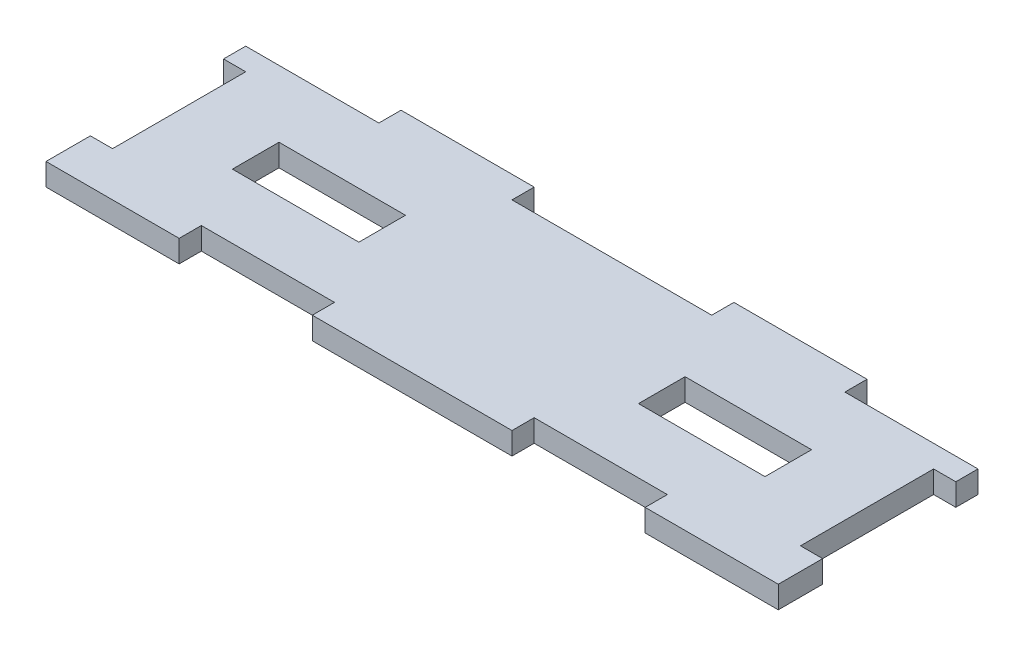
ISO-10303-21;
HEADER;
FILE_DESCRIPTION(('STEP AP214'),'2;1');
FILE_NAME('part.step','',(''),(''),'','','');
FILE_SCHEMA(('AUTOMOTIVE_DESIGN { 1 0 10303 214 1 1 1 1 }'));
ENDSEC;
DATA;
#1=APPLICATION_CONTEXT('core data for automotive mechanical design processes');
#2=APPLICATION_PROTOCOL_DEFINITION('international standard','automotive_design',2000,#1);
#3=PRODUCT_CONTEXT('',#1,'mechanical');
#4=PRODUCT('Part','Part','',(#3));
#5=PRODUCT_RELATED_PRODUCT_CATEGORY('part','',(#4));
#6=PRODUCT_DEFINITION_FORMATION('','',#4);
#7=PRODUCT_DEFINITION_CONTEXT('part definition',#1,'design');
#8=PRODUCT_DEFINITION('design','',#6,#7);
#9=PRODUCT_DEFINITION_SHAPE('','',#8);
#10=(LENGTH_UNIT() NAMED_UNIT(*) SI_UNIT(.MILLI.,.METRE.));
#11=(NAMED_UNIT(*) PLANE_ANGLE_UNIT() SI_UNIT($,.RADIAN.));
#12=(NAMED_UNIT(*) SI_UNIT($,.STERADIAN.) SOLID_ANGLE_UNIT());
#13=UNCERTAINTY_MEASURE_WITH_UNIT(LENGTH_MEASURE(1.E-05),#10,'distance_accuracy_value','');
#14=(GEOMETRIC_REPRESENTATION_CONTEXT(3) GLOBAL_UNCERTAINTY_ASSIGNED_CONTEXT((#13)) GLOBAL_UNIT_ASSIGNED_CONTEXT((#10,
#11,#12)) REPRESENTATION_CONTEXT('',''));
#15=CARTESIAN_POINT('',(0.,0.,0.));
#16=DIRECTION('',(0.,0.,1.));
#17=DIRECTION('',(1.,0.,0.));
#18=AXIS2_PLACEMENT_3D('',#15,#16,#17);
#19=CARTESIAN_POINT('',(0.,5.,0.));
#20=DIRECTION('',(0.,1.,0.));
#21=DIRECTION('',(0.,0.,1.));
#22=AXIS2_PLACEMENT_3D('',#19,#20,#21);
#23=PLANE('',#22);
#24=DIRECTION('',(1.,0.,0.));
#25=VECTOR('',#24,1.);
#26=CARTESIAN_POINT('',(22.5,5.,-19.5));
#27=LINE('',#26,#25);
#28=CARTESIAN_POINT('',(22.5,5.,-19.5));
#29=VERTEX_POINT('',#28);
#30=CARTESIAN_POINT('',(51.,5.,-19.5));
#31=VERTEX_POINT('',#30);
#32=EDGE_CURVE('E303',#29,#31,#27,.T.);
#33=ORIENTED_EDGE('',*,*,#32,.F.);
#34=DIRECTION('',(0.,0.,1.));
#35=VECTOR('',#34,1.);
#36=CARTESIAN_POINT('',(22.5,5.,-30.));
#37=LINE('',#36,#35);
#38=CARTESIAN_POINT('',(22.5,5.,-30.));
#39=VERTEX_POINT('',#38);
#40=EDGE_CURVE('E301',#39,#29,#37,.T.);
#41=ORIENTED_EDGE('',*,*,#40,.F.);
#42=DIRECTION('',(-1.,0.,0.));
#43=VECTOR('',#42,1.);
#44=CARTESIAN_POINT('',(22.5,5.,-30.));
#45=LINE('',#44,#43);
#46=CARTESIAN_POINT('',(51.,5.,-30.));
#47=VERTEX_POINT('',#46);
#48=EDGE_CURVE('E309',#47,#39,#45,.T.);
#49=ORIENTED_EDGE('',*,*,#48,.F.);
#50=DIRECTION('',(0.,0.,-1.));
#51=VECTOR('',#50,1.);
#52=CARTESIAN_POINT('',(51.,5.,-30.));
#53=LINE('',#52,#51);
#54=EDGE_CURVE('E306',#31,#47,#53,.T.);
#55=ORIENTED_EDGE('',*,*,#54,.F.);
#56=EDGE_LOOP('',(#33,#41,#49,#55));
#57=FACE_BOUND('',#56,.T.);
#58=DIRECTION('',(0.,0.,1.));
#59=VECTOR('',#58,1.);
#60=CARTESIAN_POINT('',(0.,5.,-9.99999999999998));
#61=LINE('',#60,#59);
#62=CARTESIAN_POINT('',(0.,5.,-9.99999999999998));
#63=VERTEX_POINT('',#62);
#64=CARTESIAN_POINT('',(0.,5.,0.));
#65=VERTEX_POINT('',#64);
#66=EDGE_CURVE('E332',#63,#65,#61,.T.);
#67=ORIENTED_EDGE('',*,*,#66,.T.);
#68=DIRECTION('',(1.,0.,0.));
#69=VECTOR('',#68,1.);
#70=CARTESIAN_POINT('',(0.,5.,0.));
#71=LINE('',#70,#69);
#72=CARTESIAN_POINT('',(30.,5.,0.));
#73=VERTEX_POINT('',#72);
#74=EDGE_CURVE('E335',#65,#73,#71,.T.);
#75=ORIENTED_EDGE('',*,*,#74,.T.);
#76=DIRECTION('',(0.,0.,-1.));
#77=VECTOR('',#76,1.);
#78=CARTESIAN_POINT('',(30.,5.,0.));
#79=LINE('',#78,#77);
#80=CARTESIAN_POINT('',(30.,5.,-5.));
#81=VERTEX_POINT('',#80);
#82=EDGE_CURVE('E338',#73,#81,#79,.T.);
#83=ORIENTED_EDGE('',*,*,#82,.T.);
#84=DIRECTION('',(1.,0.,0.));
#85=VECTOR('',#84,1.);
#86=CARTESIAN_POINT('',(30.,5.,-5.));
#87=LINE('',#86,#85);
#88=CARTESIAN_POINT('',(60.,5.,-5.));
#89=VERTEX_POINT('',#88);
#90=EDGE_CURVE('E340',#81,#89,#87,.T.);
#91=ORIENTED_EDGE('',*,*,#90,.T.);
#92=DIRECTION('',(0.,0.,1.));
#93=VECTOR('',#92,1.);
#94=CARTESIAN_POINT('',(60.,5.,0.));
#95=LINE('',#94,#93);
#96=CARTESIAN_POINT('',(60.,5.,0.));
#97=VERTEX_POINT('',#96);
#98=EDGE_CURVE('E342',#89,#97,#95,.T.);
#99=ORIENTED_EDGE('',*,*,#98,.T.);
#100=DIRECTION('',(1.,0.,0.));
#101=VECTOR('',#100,1.);
#102=CARTESIAN_POINT('',(60.,5.,0.));
#103=LINE('',#102,#101);
#104=CARTESIAN_POINT('',(105.,5.,0.));
#105=VERTEX_POINT('',#104);
#106=EDGE_CURVE('E344',#97,#105,#103,.T.);
#107=ORIENTED_EDGE('',*,*,#106,.T.);
#108=DIRECTION('',(0.,0.,-1.));
#109=VECTOR('',#108,1.);
#110=CARTESIAN_POINT('',(105.,5.,0.));
#111=LINE('',#110,#109);
#112=CARTESIAN_POINT('',(105.,5.,-5.));
#113=VERTEX_POINT('',#112);
#114=EDGE_CURVE('E346',#105,#113,#111,.T.);
#115=ORIENTED_EDGE('',*,*,#114,.T.);
#116=DIRECTION('',(1.,0.,0.));
#117=VECTOR('',#116,1.);
#118=CARTESIAN_POINT('',(105.,5.,-5.));
#119=LINE('',#118,#117);
#120=CARTESIAN_POINT('',(135.,5.,-5.));
#121=VERTEX_POINT('',#120);
#122=EDGE_CURVE('E348',#113,#121,#119,.T.);
#123=ORIENTED_EDGE('',*,*,#122,.T.);
#124=DIRECTION('',(0.,0.,1.));
#125=VECTOR('',#124,1.);
#126=CARTESIAN_POINT('',(135.,5.,0.));
#127=LINE('',#126,#125);
#128=CARTESIAN_POINT('',(135.,5.,0.));
#129=VERTEX_POINT('',#128);
#130=EDGE_CURVE('E350',#121,#129,#127,.T.);
#131=ORIENTED_EDGE('',*,*,#130,.T.);
#132=DIRECTION('',(1.,0.,0.));
#133=VECTOR('',#132,1.);
#134=CARTESIAN_POINT('',(135.,5.,0.));
#135=LINE('',#134,#133);
#136=CARTESIAN_POINT('',(165.,5.,0.));
#137=VERTEX_POINT('',#136);
#138=EDGE_CURVE('E352',#129,#137,#135,.T.);
#139=ORIENTED_EDGE('',*,*,#138,.T.);
#140=DIRECTION('',(0.,0.,-1.));
#141=VECTOR('',#140,1.);
#142=CARTESIAN_POINT('',(165.,5.,-9.99999999999999));
#143=LINE('',#142,#141);
#144=CARTESIAN_POINT('',(165.,5.,-9.99999999999999));
#145=VERTEX_POINT('',#144);
#146=EDGE_CURVE('E354',#137,#145,#143,.T.);
#147=ORIENTED_EDGE('',*,*,#146,.T.);
#148=DIRECTION('',(-1.,0.,0.));
#149=VECTOR('',#148,1.);
#150=CARTESIAN_POINT('',(165.,5.,-9.99999999999999));
#151=LINE('',#150,#149);
#152=CARTESIAN_POINT('',(160.,5.,-9.99999999999999));
#153=VERTEX_POINT('',#152);
#154=EDGE_CURVE('E356',#145,#153,#151,.T.);
#155=ORIENTED_EDGE('',*,*,#154,.T.);
#156=DIRECTION('',(0.,0.,-1.));
#157=VECTOR('',#156,1.);
#158=CARTESIAN_POINT('',(160.,5.,-9.99999999999999));
#159=LINE('',#158,#157);
#160=CARTESIAN_POINT('',(160.,5.,-40.));
#161=VERTEX_POINT('',#160);
#162=EDGE_CURVE('E358',#153,#161,#159,.T.);
#163=ORIENTED_EDGE('',*,*,#162,.T.);
#164=DIRECTION('',(1.,0.,0.));
#165=VECTOR('',#164,1.);
#166=CARTESIAN_POINT('',(165.,5.,-40.));
#167=LINE('',#166,#165);
#168=CARTESIAN_POINT('',(165.,5.,-40.));
#169=VERTEX_POINT('',#168);
#170=EDGE_CURVE('E360',#161,#169,#167,.T.);
#171=ORIENTED_EDGE('',*,*,#170,.T.);
#172=DIRECTION('',(0.,0.,-1.));
#173=VECTOR('',#172,1.);
#174=CARTESIAN_POINT('',(165.,5.,-40.));
#175=LINE('',#174,#173);
#176=CARTESIAN_POINT('',(165.,5.,-45.));
#177=VERTEX_POINT('',#176);
#178=EDGE_CURVE('E362',#169,#177,#175,.T.);
#179=ORIENTED_EDGE('',*,*,#178,.T.);
#180=DIRECTION('',(-1.,0.,0.));
#181=VECTOR('',#180,1.);
#182=CARTESIAN_POINT('',(135.,5.,-45.));
#183=LINE('',#182,#181);
#184=CARTESIAN_POINT('',(135.,5.,-45.));
#185=VERTEX_POINT('',#184);
#186=EDGE_CURVE('E364',#177,#185,#183,.T.);
#187=ORIENTED_EDGE('',*,*,#186,.T.);
#188=DIRECTION('',(0.,0.,-1.));
#189=VECTOR('',#188,1.);
#190=CARTESIAN_POINT('',(135.,5.,-45.));
#191=LINE('',#190,#189);
#192=CARTESIAN_POINT('',(135.,5.,-50.));
#193=VERTEX_POINT('',#192);
#194=EDGE_CURVE('E366',#185,#193,#191,.T.);
#195=ORIENTED_EDGE('',*,*,#194,.T.);
#196=DIRECTION('',(-1.,0.,0.));
#197=VECTOR('',#196,1.);
#198=CARTESIAN_POINT('',(105.,5.,-50.));
#199=LINE('',#198,#197);
#200=CARTESIAN_POINT('',(105.,5.,-50.));
#201=VERTEX_POINT('',#200);
#202=EDGE_CURVE('E368',#193,#201,#199,.T.);
#203=ORIENTED_EDGE('',*,*,#202,.T.);
#204=DIRECTION('',(0.,0.,1.));
#205=VECTOR('',#204,1.);
#206=CARTESIAN_POINT('',(105.,5.,-45.));
#207=LINE('',#206,#205);
#208=CARTESIAN_POINT('',(105.,5.,-45.));
#209=VERTEX_POINT('',#208);
#210=EDGE_CURVE('E370',#201,#209,#207,.T.);
#211=ORIENTED_EDGE('',*,*,#210,.T.);
#212=DIRECTION('',(-1.,0.,0.));
#213=VECTOR('',#212,1.);
#214=CARTESIAN_POINT('',(60.,5.,-45.));
#215=LINE('',#214,#213);
#216=CARTESIAN_POINT('',(60.,5.,-45.));
#217=VERTEX_POINT('',#216);
#218=EDGE_CURVE('E372',#209,#217,#215,.T.);
#219=ORIENTED_EDGE('',*,*,#218,.T.);
#220=DIRECTION('',(0.,0.,-1.));
#221=VECTOR('',#220,1.);
#222=CARTESIAN_POINT('',(60.,5.,-45.));
#223=LINE('',#222,#221);
#224=CARTESIAN_POINT('',(60.,5.,-50.));
#225=VERTEX_POINT('',#224);
#226=EDGE_CURVE('E374',#217,#225,#223,.T.);
#227=ORIENTED_EDGE('',*,*,#226,.T.);
#228=DIRECTION('',(-1.,0.,0.));
#229=VECTOR('',#228,1.);
#230=CARTESIAN_POINT('',(30.,5.,-50.));
#231=LINE('',#230,#229);
#232=CARTESIAN_POINT('',(30.,5.,-50.));
#233=VERTEX_POINT('',#232);
#234=EDGE_CURVE('E376',#225,#233,#231,.T.);
#235=ORIENTED_EDGE('',*,*,#234,.T.);
#236=DIRECTION('',(0.,0.,1.));
#237=VECTOR('',#236,1.);
#238=CARTESIAN_POINT('',(30.,5.,-45.));
#239=LINE('',#238,#237);
#240=CARTESIAN_POINT('',(30.,5.,-45.));
#241=VERTEX_POINT('',#240);
#242=EDGE_CURVE('E378',#233,#241,#239,.T.);
#243=ORIENTED_EDGE('',*,*,#242,.T.);
#244=DIRECTION('',(-1.,0.,0.));
#245=VECTOR('',#244,1.);
#246=CARTESIAN_POINT('',(0.,5.,-45.));
#247=LINE('',#246,#245);
#248=CARTESIAN_POINT('',(0.,5.,-45.));
#249=VERTEX_POINT('',#248);
#250=EDGE_CURVE('E380',#241,#249,#247,.T.);
#251=ORIENTED_EDGE('',*,*,#250,.T.);
#252=DIRECTION('',(0.,0.,1.));
#253=VECTOR('',#252,1.);
#254=CARTESIAN_POINT('',(0.,5.,-40.));
#255=LINE('',#254,#253);
#256=CARTESIAN_POINT('',(0.,5.,-40.));
#257=VERTEX_POINT('',#256);
#258=EDGE_CURVE('E382',#249,#257,#255,.T.);
#259=ORIENTED_EDGE('',*,*,#258,.T.);
#260=DIRECTION('',(1.,0.,0.));
#261=VECTOR('',#260,1.);
#262=CARTESIAN_POINT('',(0.,5.,-40.));
#263=LINE('',#262,#261);
#264=CARTESIAN_POINT('',(5.,5.,-40.));
#265=VERTEX_POINT('',#264);
#266=EDGE_CURVE('E384',#257,#265,#263,.T.);
#267=ORIENTED_EDGE('',*,*,#266,.T.);
#268=DIRECTION('',(0.,0.,1.));
#269=VECTOR('',#268,1.);
#270=CARTESIAN_POINT('',(5.,5.,-40.));
#271=LINE('',#270,#269);
#272=CARTESIAN_POINT('',(5.,5.,-9.99999999999998));
#273=VERTEX_POINT('',#272);
#274=EDGE_CURVE('E386',#265,#273,#271,.T.);
#275=ORIENTED_EDGE('',*,*,#274,.T.);
#276=DIRECTION('',(-1.,0.,0.));
#277=VECTOR('',#276,1.);
#278=CARTESIAN_POINT('',(0.,5.,-9.99999999999998));
#279=LINE('',#278,#277);
#280=EDGE_CURVE('E388',#273,#63,#279,.T.);
#281=ORIENTED_EDGE('',*,*,#280,.T.);
#282=EDGE_LOOP('',(#67,#75,#83,#91,#99,#107,#115,#123,#131,#139,#147,#155,#163,#171,#179,#187,
#195,#203,#211,#219,#227,#235,#243,#251,#259,#267,#275,#281));
#283=FACE_BOUND('',#282,.T.);
#284=DIRECTION('',(1.,0.,0.));
#285=VECTOR('',#284,1.);
#286=CARTESIAN_POINT('',(114.,5.,-19.5));
#287=LINE('',#286,#285);
#288=CARTESIAN_POINT('',(114.,5.,-19.5));
#289=VERTEX_POINT('',#288);
#290=CARTESIAN_POINT('',(142.5,5.,-19.5));
#291=VERTEX_POINT('',#290);
#292=EDGE_CURVE('E273',#289,#291,#287,.T.);
#293=ORIENTED_EDGE('',*,*,#292,.F.);
#294=DIRECTION('',(0.,0.,1.));
#295=VECTOR('',#294,1.);
#296=CARTESIAN_POINT('',(114.,5.,-30.));
#297=LINE('',#296,#295);
#298=CARTESIAN_POINT('',(114.,5.,-30.));
#299=VERTEX_POINT('',#298);
#300=EDGE_CURVE('E265',#299,#289,#297,.T.);
#301=ORIENTED_EDGE('',*,*,#300,.F.);
#302=DIRECTION('',(-1.,0.,0.));
#303=VECTOR('',#302,1.);
#304=CARTESIAN_POINT('',(114.,5.,-30.));
#305=LINE('',#304,#303);
#306=CARTESIAN_POINT('',(142.5,5.,-30.));
#307=VERTEX_POINT('',#306);
#308=EDGE_CURVE('E287',#307,#299,#305,.T.);
#309=ORIENTED_EDGE('',*,*,#308,.F.);
#310=DIRECTION('',(0.,0.,-1.));
#311=VECTOR('',#310,1.);
#312=CARTESIAN_POINT('',(142.5,5.,-30.));
#313=LINE('',#312,#311);
#314=EDGE_CURVE('E285',#291,#307,#313,.T.);
#315=ORIENTED_EDGE('',*,*,#314,.F.);
#316=EDGE_LOOP('',(#293,#301,#309,#315));
#317=FACE_BOUND('',#316,.T.);
#318=ADVANCED_FACE('F32',(#57,#283,#317),#23,.T.);
#319=CARTESIAN_POINT('',(0.,0.,0.));
#320=DIRECTION('',(0.,1.,0.));
#321=DIRECTION('',(0.,0.,1.));
#322=AXIS2_PLACEMENT_3D('',#319,#320,#321);
#323=PLANE('',#322);
#324=DIRECTION('',(0.,0.,1.));
#325=VECTOR('',#324,1.);
#326=CARTESIAN_POINT('',(22.5,0.,-30.));
#327=LINE('',#326,#325);
#328=CARTESIAN_POINT('',(22.5,0.,-30.));
#329=VERTEX_POINT('',#328);
#330=CARTESIAN_POINT('',(22.5,0.,-19.5));
#331=VERTEX_POINT('',#330);
#332=EDGE_CURVE('E281',#329,#331,#327,.T.);
#333=ORIENTED_EDGE('',*,*,#332,.T.);
#334=DIRECTION('',(1.,0.,0.));
#335=VECTOR('',#334,1.);
#336=CARTESIAN_POINT('',(22.5,0.,-19.5));
#337=LINE('',#336,#335);
#338=CARTESIAN_POINT('',(51.,0.,-19.5));
#339=VERTEX_POINT('',#338);
#340=EDGE_CURVE('E314',#331,#339,#337,.T.);
#341=ORIENTED_EDGE('',*,*,#340,.T.);
#342=DIRECTION('',(0.,0.,-1.));
#343=VECTOR('',#342,1.);
#344=CARTESIAN_POINT('',(51.,0.,-30.));
#345=LINE('',#344,#343);
#346=CARTESIAN_POINT('',(51.,0.,-30.));
#347=VERTEX_POINT('',#346);
#348=EDGE_CURVE('E317',#339,#347,#345,.T.);
#349=ORIENTED_EDGE('',*,*,#348,.T.);
#350=DIRECTION('',(-1.,0.,0.));
#351=VECTOR('',#350,1.);
#352=CARTESIAN_POINT('',(22.5,0.,-30.));
#353=LINE('',#352,#351);
#354=EDGE_CURVE('E304',#347,#329,#353,.T.);
#355=ORIENTED_EDGE('',*,*,#354,.T.);
#356=EDGE_LOOP('',(#333,#341,#349,#355));
#357=FACE_BOUND('',#356,.T.);
#358=DIRECTION('',(0.,0.,1.));
#359=VECTOR('',#358,1.);
#360=CARTESIAN_POINT('',(0.,0.,-9.99999999999998));
#361=LINE('',#360,#359);
#362=CARTESIAN_POINT('',(0.,0.,-9.99999999999998));
#363=VERTEX_POINT('',#362);
#364=CARTESIAN_POINT('',(0.,0.,0.));
#365=VERTEX_POINT('',#364);
#366=EDGE_CURVE('E331',#363,#365,#361,.T.);
#367=ORIENTED_EDGE('',*,*,#366,.F.);
#368=DIRECTION('',(-1.,0.,0.));
#369=VECTOR('',#368,1.);
#370=CARTESIAN_POINT('',(0.,0.,-9.99999999999998));
#371=LINE('',#370,#369);
#372=CARTESIAN_POINT('',(5.,0.,-9.99999999999998));
#373=VERTEX_POINT('',#372);
#374=EDGE_CURVE('E336',#373,#363,#371,.T.);
#375=ORIENTED_EDGE('',*,*,#374,.F.);
#376=DIRECTION('',(0.,0.,1.));
#377=VECTOR('',#376,1.);
#378=CARTESIAN_POINT('',(5.,0.,-40.));
#379=LINE('',#378,#377);
#380=CARTESIAN_POINT('',(5.,0.,-40.));
#381=VERTEX_POINT('',#380);
#382=EDGE_CURVE('E443',#381,#373,#379,.T.);
#383=ORIENTED_EDGE('',*,*,#382,.F.);
#384=DIRECTION('',(1.,0.,0.));
#385=VECTOR('',#384,1.);
#386=CARTESIAN_POINT('',(0.,0.,-40.));
#387=LINE('',#386,#385);
#388=CARTESIAN_POINT('',(0.,0.,-40.));
#389=VERTEX_POINT('',#388);
#390=EDGE_CURVE('E441',#389,#381,#387,.T.);
#391=ORIENTED_EDGE('',*,*,#390,.F.);
#392=DIRECTION('',(0.,0.,1.));
#393=VECTOR('',#392,1.);
#394=CARTESIAN_POINT('',(0.,0.,-40.));
#395=LINE('',#394,#393);
#396=CARTESIAN_POINT('',(0.,0.,-45.));
#397=VERTEX_POINT('',#396);
#398=EDGE_CURVE('E439',#397,#389,#395,.T.);
#399=ORIENTED_EDGE('',*,*,#398,.F.);
#400=DIRECTION('',(-1.,0.,0.));
#401=VECTOR('',#400,1.);
#402=CARTESIAN_POINT('',(0.,0.,-45.));
#403=LINE('',#402,#401);
#404=CARTESIAN_POINT('',(30.,0.,-45.));
#405=VERTEX_POINT('',#404);
#406=EDGE_CURVE('E437',#405,#397,#403,.T.);
#407=ORIENTED_EDGE('',*,*,#406,.F.);
#408=DIRECTION('',(0.,0.,1.));
#409=VECTOR('',#408,1.);
#410=CARTESIAN_POINT('',(30.,0.,-45.));
#411=LINE('',#410,#409);
#412=CARTESIAN_POINT('',(30.,0.,-50.));
#413=VERTEX_POINT('',#412);
#414=EDGE_CURVE('E435',#413,#405,#411,.T.);
#415=ORIENTED_EDGE('',*,*,#414,.F.);
#416=DIRECTION('',(-1.,0.,0.));
#417=VECTOR('',#416,1.);
#418=CARTESIAN_POINT('',(30.,0.,-50.));
#419=LINE('',#418,#417);
#420=CARTESIAN_POINT('',(60.,0.,-50.));
#421=VERTEX_POINT('',#420);
#422=EDGE_CURVE('E433',#421,#413,#419,.T.);
#423=ORIENTED_EDGE('',*,*,#422,.F.);
#424=DIRECTION('',(0.,0.,-1.));
#425=VECTOR('',#424,1.);
#426=CARTESIAN_POINT('',(60.,0.,-45.));
#427=LINE('',#426,#425);
#428=CARTESIAN_POINT('',(60.,0.,-45.));
#429=VERTEX_POINT('',#428);
#430=EDGE_CURVE('E431',#429,#421,#427,.T.);
#431=ORIENTED_EDGE('',*,*,#430,.F.);
#432=DIRECTION('',(-1.,0.,0.));
#433=VECTOR('',#432,1.);
#434=CARTESIAN_POINT('',(60.,0.,-45.));
#435=LINE('',#434,#433);
#436=CARTESIAN_POINT('',(105.,0.,-45.));
#437=VERTEX_POINT('',#436);
#438=EDGE_CURVE('E429',#437,#429,#435,.T.);
#439=ORIENTED_EDGE('',*,*,#438,.F.);
#440=DIRECTION('',(0.,0.,1.));
#441=VECTOR('',#440,1.);
#442=CARTESIAN_POINT('',(105.,0.,-45.));
#443=LINE('',#442,#441);
#444=CARTESIAN_POINT('',(105.,0.,-50.));
#445=VERTEX_POINT('',#444);
#446=EDGE_CURVE('E427',#445,#437,#443,.T.);
#447=ORIENTED_EDGE('',*,*,#446,.F.);
#448=DIRECTION('',(-1.,0.,0.));
#449=VECTOR('',#448,1.);
#450=CARTESIAN_POINT('',(105.,0.,-50.));
#451=LINE('',#450,#449);
#452=CARTESIAN_POINT('',(135.,0.,-50.));
#453=VERTEX_POINT('',#452);
#454=EDGE_CURVE('E425',#453,#445,#451,.T.);
#455=ORIENTED_EDGE('',*,*,#454,.F.);
#456=DIRECTION('',(0.,0.,-1.));
#457=VECTOR('',#456,1.);
#458=CARTESIAN_POINT('',(135.,0.,-45.));
#459=LINE('',#458,#457);
#460=CARTESIAN_POINT('',(135.,0.,-45.));
#461=VERTEX_POINT('',#460);
#462=EDGE_CURVE('E423',#461,#453,#459,.T.);
#463=ORIENTED_EDGE('',*,*,#462,.F.);
#464=DIRECTION('',(-1.,0.,0.));
#465=VECTOR('',#464,1.);
#466=CARTESIAN_POINT('',(135.,0.,-45.));
#467=LINE('',#466,#465);
#468=CARTESIAN_POINT('',(165.,0.,-45.));
#469=VERTEX_POINT('',#468);
#470=EDGE_CURVE('E421',#469,#461,#467,.T.);
#471=ORIENTED_EDGE('',*,*,#470,.F.);
#472=DIRECTION('',(0.,0.,-1.));
#473=VECTOR('',#472,1.);
#474=CARTESIAN_POINT('',(165.,0.,-40.));
#475=LINE('',#474,#473);
#476=CARTESIAN_POINT('',(165.,0.,-40.));
#477=VERTEX_POINT('',#476);
#478=EDGE_CURVE('E419',#477,#469,#475,.T.);
#479=ORIENTED_EDGE('',*,*,#478,.F.);
#480=DIRECTION('',(1.,0.,0.));
#481=VECTOR('',#480,1.);
#482=CARTESIAN_POINT('',(165.,0.,-40.));
#483=LINE('',#482,#481);
#484=CARTESIAN_POINT('',(160.,0.,-40.));
#485=VERTEX_POINT('',#484);
#486=EDGE_CURVE('E417',#485,#477,#483,.T.);
#487=ORIENTED_EDGE('',*,*,#486,.F.);
#488=DIRECTION('',(0.,0.,-1.));
#489=VECTOR('',#488,1.);
#490=CARTESIAN_POINT('',(160.,0.,-9.99999999999999));
#491=LINE('',#490,#489);
#492=CARTESIAN_POINT('',(160.,0.,-9.99999999999999));
#493=VERTEX_POINT('',#492);
#494=EDGE_CURVE('E415',#493,#485,#491,.T.);
#495=ORIENTED_EDGE('',*,*,#494,.F.);
#496=DIRECTION('',(-1.,0.,0.));
#497=VECTOR('',#496,1.);
#498=CARTESIAN_POINT('',(165.,0.,-9.99999999999999));
#499=LINE('',#498,#497);
#500=CARTESIAN_POINT('',(165.,0.,-9.99999999999999));
#501=VERTEX_POINT('',#500);
#502=EDGE_CURVE('E413',#501,#493,#499,.T.);
#503=ORIENTED_EDGE('',*,*,#502,.F.);
#504=DIRECTION('',(0.,0.,-1.));
#505=VECTOR('',#504,1.);
#506=CARTESIAN_POINT('',(165.,0.,-9.99999999999999));
#507=LINE('',#506,#505);
#508=CARTESIAN_POINT('',(165.,0.,0.));
#509=VERTEX_POINT('',#508);
#510=EDGE_CURVE('E411',#509,#501,#507,.T.);
#511=ORIENTED_EDGE('',*,*,#510,.F.);
#512=DIRECTION('',(1.,0.,0.));
#513=VECTOR('',#512,1.);
#514=CARTESIAN_POINT('',(135.,0.,0.));
#515=LINE('',#514,#513);
#516=CARTESIAN_POINT('',(135.,0.,0.));
#517=VERTEX_POINT('',#516);
#518=EDGE_CURVE('E409',#517,#509,#515,.T.);
#519=ORIENTED_EDGE('',*,*,#518,.F.);
#520=DIRECTION('',(0.,0.,1.));
#521=VECTOR('',#520,1.);
#522=CARTESIAN_POINT('',(135.,0.,0.));
#523=LINE('',#522,#521);
#524=CARTESIAN_POINT('',(135.,0.,-5.));
#525=VERTEX_POINT('',#524);
#526=EDGE_CURVE('E407',#525,#517,#523,.T.);
#527=ORIENTED_EDGE('',*,*,#526,.F.);
#528=DIRECTION('',(1.,0.,0.));
#529=VECTOR('',#528,1.);
#530=CARTESIAN_POINT('',(105.,0.,-5.));
#531=LINE('',#530,#529);
#532=CARTESIAN_POINT('',(105.,0.,-5.));
#533=VERTEX_POINT('',#532);
#534=EDGE_CURVE('E405',#533,#525,#531,.T.);
#535=ORIENTED_EDGE('',*,*,#534,.F.);
#536=DIRECTION('',(0.,0.,-1.));
#537=VECTOR('',#536,1.);
#538=CARTESIAN_POINT('',(105.,0.,0.));
#539=LINE('',#538,#537);
#540=CARTESIAN_POINT('',(105.,0.,0.));
#541=VERTEX_POINT('',#540);
#542=EDGE_CURVE('E403',#541,#533,#539,.T.);
#543=ORIENTED_EDGE('',*,*,#542,.F.);
#544=DIRECTION('',(1.,0.,0.));
#545=VECTOR('',#544,1.);
#546=CARTESIAN_POINT('',(60.,0.,0.));
#547=LINE('',#546,#545);
#548=CARTESIAN_POINT('',(60.,0.,0.));
#549=VERTEX_POINT('',#548);
#550=EDGE_CURVE('E401',#549,#541,#547,.T.);
#551=ORIENTED_EDGE('',*,*,#550,.F.);
#552=DIRECTION('',(0.,0.,1.));
#553=VECTOR('',#552,1.);
#554=CARTESIAN_POINT('',(60.,0.,0.));
#555=LINE('',#554,#553);
#556=CARTESIAN_POINT('',(60.,0.,-5.));
#557=VERTEX_POINT('',#556);
#558=EDGE_CURVE('E399',#557,#549,#555,.T.);
#559=ORIENTED_EDGE('',*,*,#558,.F.);
#560=DIRECTION('',(1.,0.,0.));
#561=VECTOR('',#560,1.);
#562=CARTESIAN_POINT('',(30.,0.,-5.));
#563=LINE('',#562,#561);
#564=CARTESIAN_POINT('',(30.,0.,-5.));
#565=VERTEX_POINT('',#564);
#566=EDGE_CURVE('E397',#565,#557,#563,.T.);
#567=ORIENTED_EDGE('',*,*,#566,.F.);
#568=DIRECTION('',(0.,0.,-1.));
#569=VECTOR('',#568,1.);
#570=CARTESIAN_POINT('',(30.,0.,0.));
#571=LINE('',#570,#569);
#572=CARTESIAN_POINT('',(30.,0.,0.));
#573=VERTEX_POINT('',#572);
#574=EDGE_CURVE('E395',#573,#565,#571,.T.);
#575=ORIENTED_EDGE('',*,*,#574,.F.);
#576=DIRECTION('',(1.,0.,0.));
#577=VECTOR('',#576,1.);
#578=CARTESIAN_POINT('',(0.,0.,0.));
#579=LINE('',#578,#577);
#580=EDGE_CURVE('E393',#365,#573,#579,.T.);
#581=ORIENTED_EDGE('',*,*,#580,.F.);
#582=EDGE_LOOP('',(#367,#375,#383,#391,#399,#407,#415,#423,#431,#439,#447,#455,#463,#471,#479,
#487,#495,#503,#511,#519,#527,#535,#543,#551,#559,#567,#575,#581));
#583=FACE_BOUND('',#582,.T.);
#584=DIRECTION('',(0.,0.,1.));
#585=VECTOR('',#584,1.);
#586=CARTESIAN_POINT('',(114.,0.,-30.));
#587=LINE('',#586,#585);
#588=CARTESIAN_POINT('',(114.,0.,-30.));
#589=VERTEX_POINT('',#588);
#590=CARTESIAN_POINT('',(114.,0.,-19.5));
#591=VERTEX_POINT('',#590);
#592=EDGE_CURVE('E55',#589,#591,#587,.T.);
#593=ORIENTED_EDGE('',*,*,#592,.T.);
#594=DIRECTION('',(1.,0.,0.));
#595=VECTOR('',#594,1.);
#596=CARTESIAN_POINT('',(114.,0.,-19.5));
#597=LINE('',#596,#595);
#598=CARTESIAN_POINT('',(142.5,0.,-19.5));
#599=VERTEX_POINT('',#598);
#600=EDGE_CURVE('E280',#591,#599,#597,.T.);
#601=ORIENTED_EDGE('',*,*,#600,.T.);
#602=DIRECTION('',(0.,0.,-1.));
#603=VECTOR('',#602,1.);
#604=CARTESIAN_POINT('',(142.5,0.,-30.));
#605=LINE('',#604,#603);
#606=CARTESIAN_POINT('',(142.5,0.,-30.));
#607=VERTEX_POINT('',#606);
#608=EDGE_CURVE('E293',#599,#607,#605,.T.);
#609=ORIENTED_EDGE('',*,*,#608,.T.);
#610=DIRECTION('',(-1.,0.,0.));
#611=VECTOR('',#610,1.);
#612=CARTESIAN_POINT('',(114.,0.,-30.));
#613=LINE('',#612,#611);
#614=EDGE_CURVE('E274',#607,#589,#613,.T.);
#615=ORIENTED_EDGE('',*,*,#614,.T.);
#616=EDGE_LOOP('',(#593,#601,#609,#615));
#617=FACE_BOUND('',#616,.T.);
#618=ADVANCED_FACE('F533',(#357,#583,#617),#323,.F.);
#619=CARTESIAN_POINT('',(0.,5.,-9.99999999999998));
#620=DIRECTION('',(1.,0.,0.));
#621=DIRECTION('',(0.,0.,-1.));
#622=AXIS2_PLACEMENT_3D('',#619,#620,#621);
#623=PLANE('',#622);
#624=ORIENTED_EDGE('',*,*,#366,.T.);
#625=DIRECTION('',(0.,-1.,0.));
#626=VECTOR('',#625,1.);
#627=CARTESIAN_POINT('',(0.,5.,0.));
#628=LINE('',#627,#626);
#629=EDGE_CURVE('E11',#65,#365,#628,.T.);
#630=ORIENTED_EDGE('',*,*,#629,.F.);
#631=ORIENTED_EDGE('',*,*,#66,.F.);
#632=DIRECTION('',(0.,-1.,0.));
#633=VECTOR('',#632,1.);
#634=CARTESIAN_POINT('',(0.,5.,-9.99999999999998));
#635=LINE('',#634,#633);
#636=EDGE_CURVE('E390',#63,#363,#635,.T.);
#637=ORIENTED_EDGE('',*,*,#636,.T.);
#638=EDGE_LOOP('',(#624,#630,#631,#637));
#639=FACE_BOUND('',#638,.T.);
#640=ADVANCED_FACE('F34',(#639),#623,.F.);
#641=CARTESIAN_POINT('',(0.,5.,0.));
#642=DIRECTION('',(0.,0.,-1.));
#643=DIRECTION('',(-1.,0.,0.));
#644=AXIS2_PLACEMENT_3D('',#641,#642,#643);
#645=PLANE('',#644);
#646=ORIENTED_EDGE('',*,*,#580,.T.);
#647=DIRECTION('',(0.,-1.,0.));
#648=VECTOR('',#647,1.);
#649=CARTESIAN_POINT('',(30.,5.,0.));
#650=LINE('',#649,#648);
#651=EDGE_CURVE('E40',#73,#573,#650,.T.);
#652=ORIENTED_EDGE('',*,*,#651,.F.);
#653=ORIENTED_EDGE('',*,*,#74,.F.);
#654=ORIENTED_EDGE('',*,*,#629,.T.);
#655=EDGE_LOOP('',(#646,#652,#653,#654));
#656=FACE_BOUND('',#655,.T.);
#657=ADVANCED_FACE('F550',(#656),#645,.F.);
#658=CARTESIAN_POINT('',(30.,5.,0.));
#659=DIRECTION('',(-1.,0.,0.));
#660=DIRECTION('',(0.,0.,1.));
#661=AXIS2_PLACEMENT_3D('',#658,#659,#660);
#662=PLANE('',#661);
#663=ORIENTED_EDGE('',*,*,#574,.T.);
#664=DIRECTION('',(0.,-1.,0.));
#665=VECTOR('',#664,1.);
#666=CARTESIAN_POINT('',(30.,5.,-5.));
#667=LINE('',#666,#665);
#668=EDGE_CURVE('E520',#81,#565,#667,.T.);
#669=ORIENTED_EDGE('',*,*,#668,.F.);
#670=ORIENTED_EDGE('',*,*,#82,.F.);
#671=ORIENTED_EDGE('',*,*,#651,.T.);
#672=EDGE_LOOP('',(#663,#669,#670,#671));
#673=FACE_BOUND('',#672,.T.);
#674=ADVANCED_FACE('F527',(#673),#662,.F.);
#675=CARTESIAN_POINT('',(30.,5.,-5.));
#676=DIRECTION('',(0.,0.,-1.));
#677=DIRECTION('',(-1.,0.,0.));
#678=AXIS2_PLACEMENT_3D('',#675,#676,#677);
#679=PLANE('',#678);
#680=ORIENTED_EDGE('',*,*,#566,.T.);
#681=DIRECTION('',(0.,-1.,0.));
#682=VECTOR('',#681,1.);
#683=CARTESIAN_POINT('',(60.,5.,-5.));
#684=LINE('',#683,#682);
#685=EDGE_CURVE('E517',#89,#557,#684,.T.);
#686=ORIENTED_EDGE('',*,*,#685,.F.);
#687=ORIENTED_EDGE('',*,*,#90,.F.);
#688=ORIENTED_EDGE('',*,*,#668,.T.);
#689=EDGE_LOOP('',(#680,#686,#687,#688));
#690=FACE_BOUND('',#689,.T.);
#691=ADVANCED_FACE('F539',(#690),#679,.F.);
#692=CARTESIAN_POINT('',(60.,5.,0.));
#693=DIRECTION('',(1.,0.,0.));
#694=DIRECTION('',(0.,0.,-1.));
#695=AXIS2_PLACEMENT_3D('',#692,#693,#694);
#696=PLANE('',#695);
#697=ORIENTED_EDGE('',*,*,#558,.T.);
#698=DIRECTION('',(0.,-1.,0.));
#699=VECTOR('',#698,1.);
#700=CARTESIAN_POINT('',(60.,5.,0.));
#701=LINE('',#700,#699);
#702=EDGE_CURVE('E514',#97,#549,#701,.T.);
#703=ORIENTED_EDGE('',*,*,#702,.F.);
#704=ORIENTED_EDGE('',*,*,#98,.F.);
#705=ORIENTED_EDGE('',*,*,#685,.T.);
#706=EDGE_LOOP('',(#697,#703,#704,#705));
#707=FACE_BOUND('',#706,.T.);
#708=ADVANCED_FACE('F543',(#707),#696,.F.);
#709=CARTESIAN_POINT('',(60.,5.,0.));
#710=DIRECTION('',(0.,0.,-1.));
#711=DIRECTION('',(-1.,0.,0.));
#712=AXIS2_PLACEMENT_3D('',#709,#710,#711);
#713=PLANE('',#712);
#714=ORIENTED_EDGE('',*,*,#550,.T.);
#715=DIRECTION('',(0.,-1.,0.));
#716=VECTOR('',#715,1.);
#717=CARTESIAN_POINT('',(105.,5.,0.));
#718=LINE('',#717,#716);
#719=EDGE_CURVE('E511',#105,#541,#718,.T.);
#720=ORIENTED_EDGE('',*,*,#719,.F.);
#721=ORIENTED_EDGE('',*,*,#106,.F.);
#722=ORIENTED_EDGE('',*,*,#702,.T.);
#723=EDGE_LOOP('',(#714,#720,#721,#722));
#724=FACE_BOUND('',#723,.T.);
#725=ADVANCED_FACE('F663',(#724),#713,.F.);
#726=CARTESIAN_POINT('',(105.,5.,0.));
#727=DIRECTION('',(-1.,0.,0.));
#728=DIRECTION('',(0.,0.,1.));
#729=AXIS2_PLACEMENT_3D('',#726,#727,#728);
#730=PLANE('',#729);
#731=ORIENTED_EDGE('',*,*,#542,.T.);
#732=DIRECTION('',(0.,-1.,0.));
#733=VECTOR('',#732,1.);
#734=CARTESIAN_POINT('',(105.,5.,-5.));
#735=LINE('',#734,#733);
#736=EDGE_CURVE('E508',#113,#533,#735,.T.);
#737=ORIENTED_EDGE('',*,*,#736,.F.);
#738=ORIENTED_EDGE('',*,*,#114,.F.);
#739=ORIENTED_EDGE('',*,*,#719,.T.);
#740=EDGE_LOOP('',(#731,#737,#738,#739));
#741=FACE_BOUND('',#740,.T.);
#742=ADVANCED_FACE('F660',(#741),#730,.F.);
#743=CARTESIAN_POINT('',(105.,5.,-5.));
#744=DIRECTION('',(0.,0.,-1.));
#745=DIRECTION('',(-1.,0.,0.));
#746=AXIS2_PLACEMENT_3D('',#743,#744,#745);
#747=PLANE('',#746);
#748=ORIENTED_EDGE('',*,*,#534,.T.);
#749=DIRECTION('',(0.,-1.,0.));
#750=VECTOR('',#749,1.);
#751=CARTESIAN_POINT('',(135.,5.,-5.));
#752=LINE('',#751,#750);
#753=EDGE_CURVE('E505',#121,#525,#752,.T.);
#754=ORIENTED_EDGE('',*,*,#753,.F.);
#755=ORIENTED_EDGE('',*,*,#122,.F.);
#756=ORIENTED_EDGE('',*,*,#736,.T.);
#757=EDGE_LOOP('',(#748,#754,#755,#756));
#758=FACE_BOUND('',#757,.T.);
#759=ADVANCED_FACE('F656',(#758),#747,.F.);
#760=CARTESIAN_POINT('',(135.,5.,0.));
#761=DIRECTION('',(1.,0.,0.));
#762=DIRECTION('',(0.,0.,-1.));
#763=AXIS2_PLACEMENT_3D('',#760,#761,#762);
#764=PLANE('',#763);
#765=ORIENTED_EDGE('',*,*,#526,.T.);
#766=DIRECTION('',(0.,-1.,0.));
#767=VECTOR('',#766,1.);
#768=CARTESIAN_POINT('',(135.,5.,0.));
#769=LINE('',#768,#767);
#770=EDGE_CURVE('E502',#129,#517,#769,.T.);
#771=ORIENTED_EDGE('',*,*,#770,.F.);
#772=ORIENTED_EDGE('',*,*,#130,.F.);
#773=ORIENTED_EDGE('',*,*,#753,.T.);
#774=EDGE_LOOP('',(#765,#771,#772,#773));
#775=FACE_BOUND('',#774,.T.);
#776=ADVANCED_FACE('F652',(#775),#764,.F.);
#777=CARTESIAN_POINT('',(135.,5.,0.));
#778=DIRECTION('',(0.,0.,-1.));
#779=DIRECTION('',(-1.,0.,0.));
#780=AXIS2_PLACEMENT_3D('',#777,#778,#779);
#781=PLANE('',#780);
#782=ORIENTED_EDGE('',*,*,#518,.T.);
#783=DIRECTION('',(0.,-1.,0.));
#784=VECTOR('',#783,1.);
#785=CARTESIAN_POINT('',(165.,5.,0.));
#786=LINE('',#785,#784);
#787=EDGE_CURVE('E499',#137,#509,#786,.T.);
#788=ORIENTED_EDGE('',*,*,#787,.F.);
#789=ORIENTED_EDGE('',*,*,#138,.F.);
#790=ORIENTED_EDGE('',*,*,#770,.T.);
#791=EDGE_LOOP('',(#782,#788,#789,#790));
#792=FACE_BOUND('',#791,.T.);
#793=ADVANCED_FACE('F647',(#792),#781,.F.);
#794=CARTESIAN_POINT('',(165.,5.,-9.99999999999999));
#795=DIRECTION('',(-1.,0.,0.));
#796=DIRECTION('',(0.,0.,1.));
#797=AXIS2_PLACEMENT_3D('',#794,#795,#796);
#798=PLANE('',#797);
#799=ORIENTED_EDGE('',*,*,#510,.T.);
#800=DIRECTION('',(0.,-1.,0.));
#801=VECTOR('',#800,1.);
#802=CARTESIAN_POINT('',(165.,5.,-9.99999999999999));
#803=LINE('',#802,#801);
#804=EDGE_CURVE('E496',#145,#501,#803,.T.);
#805=ORIENTED_EDGE('',*,*,#804,.F.);
#806=ORIENTED_EDGE('',*,*,#146,.F.);
#807=ORIENTED_EDGE('',*,*,#787,.T.);
#808=EDGE_LOOP('',(#799,#805,#806,#807));
#809=FACE_BOUND('',#808,.T.);
#810=ADVANCED_FACE('F641',(#809),#798,.F.);
#811=CARTESIAN_POINT('',(165.,5.,-9.99999999999999));
#812=DIRECTION('',(0.,0.,1.));
#813=DIRECTION('',(1.,0.,0.));
#814=AXIS2_PLACEMENT_3D('',#811,#812,#813);
#815=PLANE('',#814);
#816=ORIENTED_EDGE('',*,*,#502,.T.);
#817=DIRECTION('',(0.,-1.,0.));
#818=VECTOR('',#817,1.);
#819=CARTESIAN_POINT('',(160.,5.,-9.99999999999999));
#820=LINE('',#819,#818);
#821=EDGE_CURVE('E493',#153,#493,#820,.T.);
#822=ORIENTED_EDGE('',*,*,#821,.F.);
#823=ORIENTED_EDGE('',*,*,#154,.F.);
#824=ORIENTED_EDGE('',*,*,#804,.T.);
#825=EDGE_LOOP('',(#816,#822,#823,#824));
#826=FACE_BOUND('',#825,.T.);
#827=ADVANCED_FACE('F637',(#826),#815,.F.);
#828=CARTESIAN_POINT('',(160.,5.,-9.99999999999999));
#829=DIRECTION('',(-1.,0.,0.));
#830=DIRECTION('',(0.,0.,1.));
#831=AXIS2_PLACEMENT_3D('',#828,#829,#830);
#832=PLANE('',#831);
#833=ORIENTED_EDGE('',*,*,#494,.T.);
#834=DIRECTION('',(0.,-1.,0.));
#835=VECTOR('',#834,1.);
#836=CARTESIAN_POINT('',(160.,5.,-40.));
#837=LINE('',#836,#835);
#838=EDGE_CURVE('E490',#161,#485,#837,.T.);
#839=ORIENTED_EDGE('',*,*,#838,.F.);
#840=ORIENTED_EDGE('',*,*,#162,.F.);
#841=ORIENTED_EDGE('',*,*,#821,.T.);
#842=EDGE_LOOP('',(#833,#839,#840,#841));
#843=FACE_BOUND('',#842,.T.);
#844=ADVANCED_FACE('F632',(#843),#832,.F.);
#845=CARTESIAN_POINT('',(165.,5.,-40.));
#846=DIRECTION('',(0.,0.,-1.));
#847=DIRECTION('',(-1.,0.,0.));
#848=AXIS2_PLACEMENT_3D('',#845,#846,#847);
#849=PLANE('',#848);
#850=ORIENTED_EDGE('',*,*,#486,.T.);
#851=DIRECTION('',(0.,-1.,0.));
#852=VECTOR('',#851,1.);
#853=CARTESIAN_POINT('',(165.,5.,-40.));
#854=LINE('',#853,#852);
#855=EDGE_CURVE('E487',#169,#477,#854,.T.);
#856=ORIENTED_EDGE('',*,*,#855,.F.);
#857=ORIENTED_EDGE('',*,*,#170,.F.);
#858=ORIENTED_EDGE('',*,*,#838,.T.);
#859=EDGE_LOOP('',(#850,#856,#857,#858));
#860=FACE_BOUND('',#859,.T.);
#861=ADVANCED_FACE('F626',(#860),#849,.F.);
#862=CARTESIAN_POINT('',(165.,5.,-40.));
#863=DIRECTION('',(-1.,0.,0.));
#864=DIRECTION('',(0.,0.,1.));
#865=AXIS2_PLACEMENT_3D('',#862,#863,#864);
#866=PLANE('',#865);
#867=ORIENTED_EDGE('',*,*,#478,.T.);
#868=DIRECTION('',(0.,-1.,0.));
#869=VECTOR('',#868,1.);
#870=CARTESIAN_POINT('',(165.,5.,-45.));
#871=LINE('',#870,#869);
#872=EDGE_CURVE('E484',#177,#469,#871,.T.);
#873=ORIENTED_EDGE('',*,*,#872,.F.);
#874=ORIENTED_EDGE('',*,*,#178,.F.);
#875=ORIENTED_EDGE('',*,*,#855,.T.);
#876=EDGE_LOOP('',(#867,#873,#874,#875));
#877=FACE_BOUND('',#876,.T.);
#878=ADVANCED_FACE('F622',(#877),#866,.F.);
#879=CARTESIAN_POINT('',(135.,5.,-45.));
#880=DIRECTION('',(0.,0.,1.));
#881=DIRECTION('',(1.,0.,0.));
#882=AXIS2_PLACEMENT_3D('',#879,#880,#881);
#883=PLANE('',#882);
#884=ORIENTED_EDGE('',*,*,#470,.T.);
#885=DIRECTION('',(0.,-1.,0.));
#886=VECTOR('',#885,1.);
#887=CARTESIAN_POINT('',(135.,5.,-45.));
#888=LINE('',#887,#886);
#889=EDGE_CURVE('E481',#185,#461,#888,.T.);
#890=ORIENTED_EDGE('',*,*,#889,.F.);
#891=ORIENTED_EDGE('',*,*,#186,.F.);
#892=ORIENTED_EDGE('',*,*,#872,.T.);
#893=EDGE_LOOP('',(#884,#890,#891,#892));
#894=FACE_BOUND('',#893,.T.);
#895=ADVANCED_FACE('F617',(#894),#883,.F.);
#896=CARTESIAN_POINT('',(135.,5.,-45.));
#897=DIRECTION('',(-1.,0.,0.));
#898=DIRECTION('',(0.,0.,1.));
#899=AXIS2_PLACEMENT_3D('',#896,#897,#898);
#900=PLANE('',#899);
#901=ORIENTED_EDGE('',*,*,#462,.T.);
#902=DIRECTION('',(0.,-1.,0.));
#903=VECTOR('',#902,1.);
#904=CARTESIAN_POINT('',(135.,5.,-50.));
#905=LINE('',#904,#903);
#906=EDGE_CURVE('E478',#193,#453,#905,.T.);
#907=ORIENTED_EDGE('',*,*,#906,.F.);
#908=ORIENTED_EDGE('',*,*,#194,.F.);
#909=ORIENTED_EDGE('',*,*,#889,.T.);
#910=EDGE_LOOP('',(#901,#907,#908,#909));
#911=FACE_BOUND('',#910,.T.);
#912=ADVANCED_FACE('F611',(#911),#900,.F.);
#913=CARTESIAN_POINT('',(105.,5.,-50.));
#914=DIRECTION('',(0.,0.,1.));
#915=DIRECTION('',(1.,0.,0.));
#916=AXIS2_PLACEMENT_3D('',#913,#914,#915);
#917=PLANE('',#916);
#918=ORIENTED_EDGE('',*,*,#454,.T.);
#919=DIRECTION('',(0.,-1.,0.));
#920=VECTOR('',#919,1.);
#921=CARTESIAN_POINT('',(105.,5.,-50.));
#922=LINE('',#921,#920);
#923=EDGE_CURVE('E475',#201,#445,#922,.T.);
#924=ORIENTED_EDGE('',*,*,#923,.F.);
#925=ORIENTED_EDGE('',*,*,#202,.F.);
#926=ORIENTED_EDGE('',*,*,#906,.T.);
#927=EDGE_LOOP('',(#918,#924,#925,#926));
#928=FACE_BOUND('',#927,.T.);
#929=ADVANCED_FACE('F607',(#928),#917,.F.);
#930=CARTESIAN_POINT('',(105.,5.,-45.));
#931=DIRECTION('',(1.,0.,0.));
#932=DIRECTION('',(0.,0.,-1.));
#933=AXIS2_PLACEMENT_3D('',#930,#931,#932);
#934=PLANE('',#933);
#935=ORIENTED_EDGE('',*,*,#446,.T.);
#936=DIRECTION('',(0.,-1.,0.));
#937=VECTOR('',#936,1.);
#938=CARTESIAN_POINT('',(105.,5.,-45.));
#939=LINE('',#938,#937);
#940=EDGE_CURVE('E472',#209,#437,#939,.T.);
#941=ORIENTED_EDGE('',*,*,#940,.F.);
#942=ORIENTED_EDGE('',*,*,#210,.F.);
#943=ORIENTED_EDGE('',*,*,#923,.T.);
#944=EDGE_LOOP('',(#935,#941,#942,#943));
#945=FACE_BOUND('',#944,.T.);
#946=ADVANCED_FACE('F602',(#945),#934,.F.);
#947=CARTESIAN_POINT('',(60.,5.,-45.));
#948=DIRECTION('',(0.,0.,1.));
#949=DIRECTION('',(1.,0.,0.));
#950=AXIS2_PLACEMENT_3D('',#947,#948,#949);
#951=PLANE('',#950);
#952=ORIENTED_EDGE('',*,*,#438,.T.);
#953=DIRECTION('',(0.,-1.,0.));
#954=VECTOR('',#953,1.);
#955=CARTESIAN_POINT('',(60.,5.,-45.));
#956=LINE('',#955,#954);
#957=EDGE_CURVE('E469',#217,#429,#956,.T.);
#958=ORIENTED_EDGE('',*,*,#957,.F.);
#959=ORIENTED_EDGE('',*,*,#218,.F.);
#960=ORIENTED_EDGE('',*,*,#940,.T.);
#961=EDGE_LOOP('',(#952,#958,#959,#960));
#962=FACE_BOUND('',#961,.T.);
#963=ADVANCED_FACE('F596',(#962),#951,.F.);
#964=CARTESIAN_POINT('',(60.,5.,-45.));
#965=DIRECTION('',(-1.,0.,0.));
#966=DIRECTION('',(0.,0.,1.));
#967=AXIS2_PLACEMENT_3D('',#964,#965,#966);
#968=PLANE('',#967);
#969=ORIENTED_EDGE('',*,*,#430,.T.);
#970=DIRECTION('',(0.,-1.,0.));
#971=VECTOR('',#970,1.);
#972=CARTESIAN_POINT('',(60.,5.,-50.));
#973=LINE('',#972,#971);
#974=EDGE_CURVE('E466',#225,#421,#973,.T.);
#975=ORIENTED_EDGE('',*,*,#974,.F.);
#976=ORIENTED_EDGE('',*,*,#226,.F.);
#977=ORIENTED_EDGE('',*,*,#957,.T.);
#978=EDGE_LOOP('',(#969,#975,#976,#977));
#979=FACE_BOUND('',#978,.T.);
#980=ADVANCED_FACE('F592',(#979),#968,.F.);
#981=CARTESIAN_POINT('',(30.,5.,-50.));
#982=DIRECTION('',(0.,0.,1.));
#983=DIRECTION('',(1.,0.,0.));
#984=AXIS2_PLACEMENT_3D('',#981,#982,#983);
#985=PLANE('',#984);
#986=ORIENTED_EDGE('',*,*,#422,.T.);
#987=DIRECTION('',(0.,-1.,0.));
#988=VECTOR('',#987,1.);
#989=CARTESIAN_POINT('',(30.,5.,-50.));
#990=LINE('',#989,#988);
#991=EDGE_CURVE('E463',#233,#413,#990,.T.);
#992=ORIENTED_EDGE('',*,*,#991,.F.);
#993=ORIENTED_EDGE('',*,*,#234,.F.);
#994=ORIENTED_EDGE('',*,*,#974,.T.);
#995=EDGE_LOOP('',(#986,#992,#993,#994));
#996=FACE_BOUND('',#995,.T.);
#997=ADVANCED_FACE('F587',(#996),#985,.F.);
#998=CARTESIAN_POINT('',(30.,5.,-45.));
#999=DIRECTION('',(1.,0.,0.));
#1000=DIRECTION('',(0.,0.,-1.));
#1001=AXIS2_PLACEMENT_3D('',#998,#999,#1000);
#1002=PLANE('',#1001);
#1003=ORIENTED_EDGE('',*,*,#414,.T.);
#1004=DIRECTION('',(0.,-1.,0.));
#1005=VECTOR('',#1004,1.);
#1006=CARTESIAN_POINT('',(30.,5.,-45.));
#1007=LINE('',#1006,#1005);
#1008=EDGE_CURVE('E460',#241,#405,#1007,.T.);
#1009=ORIENTED_EDGE('',*,*,#1008,.F.);
#1010=ORIENTED_EDGE('',*,*,#242,.F.);
#1011=ORIENTED_EDGE('',*,*,#991,.T.);
#1012=EDGE_LOOP('',(#1003,#1009,#1010,#1011));
#1013=FACE_BOUND('',#1012,.T.);
#1014=ADVANCED_FACE('F581',(#1013),#1002,.F.);
#1015=CARTESIAN_POINT('',(0.,5.,-45.));
#1016=DIRECTION('',(0.,0.,1.));
#1017=DIRECTION('',(1.,0.,0.));
#1018=AXIS2_PLACEMENT_3D('',#1015,#1016,#1017);
#1019=PLANE('',#1018);
#1020=ORIENTED_EDGE('',*,*,#406,.T.);
#1021=DIRECTION('',(0.,-1.,0.));
#1022=VECTOR('',#1021,1.);
#1023=CARTESIAN_POINT('',(0.,5.,-45.));
#1024=LINE('',#1023,#1022);
#1025=EDGE_CURVE('E457',#249,#397,#1024,.T.);
#1026=ORIENTED_EDGE('',*,*,#1025,.F.);
#1027=ORIENTED_EDGE('',*,*,#250,.F.);
#1028=ORIENTED_EDGE('',*,*,#1008,.T.);
#1029=EDGE_LOOP('',(#1020,#1026,#1027,#1028));
#1030=FACE_BOUND('',#1029,.T.);
#1031=ADVANCED_FACE('F577',(#1030),#1019,.F.);
#1032=CARTESIAN_POINT('',(0.,5.,-40.));
#1033=DIRECTION('',(1.,0.,0.));
#1034=DIRECTION('',(0.,0.,-1.));
#1035=AXIS2_PLACEMENT_3D('',#1032,#1033,#1034);
#1036=PLANE('',#1035);
#1037=ORIENTED_EDGE('',*,*,#398,.T.);
#1038=DIRECTION('',(0.,-1.,0.));
#1039=VECTOR('',#1038,1.);
#1040=CARTESIAN_POINT('',(0.,5.,-40.));
#1041=LINE('',#1040,#1039);
#1042=EDGE_CURVE('E454',#257,#389,#1041,.T.);
#1043=ORIENTED_EDGE('',*,*,#1042,.F.);
#1044=ORIENTED_EDGE('',*,*,#258,.F.);
#1045=ORIENTED_EDGE('',*,*,#1025,.T.);
#1046=EDGE_LOOP('',(#1037,#1043,#1044,#1045));
#1047=FACE_BOUND('',#1046,.T.);
#1048=ADVANCED_FACE('F572',(#1047),#1036,.F.);
#1049=CARTESIAN_POINT('',(0.,5.,-40.));
#1050=DIRECTION('',(0.,0.,-1.));
#1051=DIRECTION('',(-1.,0.,0.));
#1052=AXIS2_PLACEMENT_3D('',#1049,#1050,#1051);
#1053=PLANE('',#1052);
#1054=ORIENTED_EDGE('',*,*,#390,.T.);
#1055=DIRECTION('',(0.,-1.,0.));
#1056=VECTOR('',#1055,1.);
#1057=CARTESIAN_POINT('',(5.,5.,-40.));
#1058=LINE('',#1057,#1056);
#1059=EDGE_CURVE('E451',#265,#381,#1058,.T.);
#1060=ORIENTED_EDGE('',*,*,#1059,.F.);
#1061=ORIENTED_EDGE('',*,*,#266,.F.);
#1062=ORIENTED_EDGE('',*,*,#1042,.T.);
#1063=EDGE_LOOP('',(#1054,#1060,#1061,#1062));
#1064=FACE_BOUND('',#1063,.T.);
#1065=ADVANCED_FACE('F566',(#1064),#1053,.F.);
#1066=CARTESIAN_POINT('',(5.,5.,-40.));
#1067=DIRECTION('',(1.,0.,0.));
#1068=DIRECTION('',(0.,0.,-1.));
#1069=AXIS2_PLACEMENT_3D('',#1066,#1067,#1068);
#1070=PLANE('',#1069);
#1071=ORIENTED_EDGE('',*,*,#382,.T.);
#1072=DIRECTION('',(0.,-1.,0.));
#1073=VECTOR('',#1072,1.);
#1074=CARTESIAN_POINT('',(5.,5.,-9.99999999999998));
#1075=LINE('',#1074,#1073);
#1076=EDGE_CURVE('E448',#273,#373,#1075,.T.);
#1077=ORIENTED_EDGE('',*,*,#1076,.F.);
#1078=ORIENTED_EDGE('',*,*,#274,.F.);
#1079=ORIENTED_EDGE('',*,*,#1059,.T.);
#1080=EDGE_LOOP('',(#1071,#1077,#1078,#1079));
#1081=FACE_BOUND('',#1080,.T.);
#1082=ADVANCED_FACE('F562',(#1081),#1070,.F.);
#1083=CARTESIAN_POINT('',(0.,5.,-9.99999999999998));
#1084=DIRECTION('',(0.,0.,1.));
#1085=DIRECTION('',(1.,0.,0.));
#1086=AXIS2_PLACEMENT_3D('',#1083,#1084,#1085);
#1087=PLANE('',#1086);
#1088=ORIENTED_EDGE('',*,*,#374,.T.);
#1089=ORIENTED_EDGE('',*,*,#636,.F.);
#1090=ORIENTED_EDGE('',*,*,#280,.F.);
#1091=ORIENTED_EDGE('',*,*,#1076,.T.);
#1092=EDGE_LOOP('',(#1088,#1089,#1090,#1091));
#1093=FACE_BOUND('',#1092,.T.);
#1094=ADVANCED_FACE('F557',(#1093),#1087,.F.);
#1095=CARTESIAN_POINT('',(22.5,5.,-30.));
#1096=DIRECTION('',(1.,0.,0.));
#1097=DIRECTION('',(0.,0.,-1.));
#1098=AXIS2_PLACEMENT_3D('',#1095,#1096,#1097);
#1099=PLANE('',#1098);
#1100=ORIENTED_EDGE('',*,*,#332,.F.);
#1101=DIRECTION('',(0.,-1.,0.));
#1102=VECTOR('',#1101,1.);
#1103=CARTESIAN_POINT('',(22.5,5.,-30.));
#1104=LINE('',#1103,#1102);
#1105=EDGE_CURVE('E311',#39,#329,#1104,.T.);
#1106=ORIENTED_EDGE('',*,*,#1105,.F.);
#1107=ORIENTED_EDGE('',*,*,#40,.T.);
#1108=DIRECTION('',(0.,-1.,0.));
#1109=VECTOR('',#1108,1.);
#1110=CARTESIAN_POINT('',(22.5,5.,-19.5));
#1111=LINE('',#1110,#1109);
#1112=EDGE_CURVE('E328',#29,#331,#1111,.T.);
#1113=ORIENTED_EDGE('',*,*,#1112,.T.);
#1114=EDGE_LOOP('',(#1100,#1106,#1107,#1113));
#1115=FACE_BOUND('',#1114,.T.);
#1116=ADVANCED_FACE('F682',(#1115),#1099,.T.);
#1117=CARTESIAN_POINT('',(22.5,5.,-19.5));
#1118=DIRECTION('',(0.,0.,-1.));
#1119=DIRECTION('',(-1.,0.,0.));
#1120=AXIS2_PLACEMENT_3D('',#1117,#1118,#1119);
#1121=PLANE('',#1120);
#1122=ORIENTED_EDGE('',*,*,#340,.F.);
#1123=ORIENTED_EDGE('',*,*,#1112,.F.);
#1124=ORIENTED_EDGE('',*,*,#32,.T.);
#1125=DIRECTION('',(0.,-1.,0.));
#1126=VECTOR('',#1125,1.);
#1127=CARTESIAN_POINT('',(51.,5.,-19.5));
#1128=LINE('',#1127,#1126);
#1129=EDGE_CURVE('E326',#31,#339,#1128,.T.);
#1130=ORIENTED_EDGE('',*,*,#1129,.T.);
#1131=EDGE_LOOP('',(#1122,#1123,#1124,#1130));
#1132=FACE_BOUND('',#1131,.T.);
#1133=ADVANCED_FACE('F816',(#1132),#1121,.T.);
#1134=CARTESIAN_POINT('',(51.,5.,-30.));
#1135=DIRECTION('',(-1.,0.,0.));
#1136=DIRECTION('',(0.,0.,1.));
#1137=AXIS2_PLACEMENT_3D('',#1134,#1135,#1136);
#1138=PLANE('',#1137);
#1139=ORIENTED_EDGE('',*,*,#348,.F.);
#1140=ORIENTED_EDGE('',*,*,#1129,.F.);
#1141=ORIENTED_EDGE('',*,*,#54,.T.);
#1142=DIRECTION('',(0.,-1.,0.));
#1143=VECTOR('',#1142,1.);
#1144=CARTESIAN_POINT('',(51.,5.,-30.));
#1145=LINE('',#1144,#1143);
#1146=EDGE_CURVE('E324',#47,#347,#1145,.T.);
#1147=ORIENTED_EDGE('',*,*,#1146,.T.);
#1148=EDGE_LOOP('',(#1139,#1140,#1141,#1147));
#1149=FACE_BOUND('',#1148,.T.);
#1150=ADVANCED_FACE('F823',(#1149),#1138,.T.);
#1151=CARTESIAN_POINT('',(22.5,5.,-30.));
#1152=DIRECTION('',(0.,0.,1.));
#1153=DIRECTION('',(1.,0.,0.));
#1154=AXIS2_PLACEMENT_3D('',#1151,#1152,#1153);
#1155=PLANE('',#1154);
#1156=ORIENTED_EDGE('',*,*,#354,.F.);
#1157=ORIENTED_EDGE('',*,*,#1146,.F.);
#1158=ORIENTED_EDGE('',*,*,#48,.T.);
#1159=ORIENTED_EDGE('',*,*,#1105,.T.);
#1160=EDGE_LOOP('',(#1156,#1157,#1158,#1159));
#1161=FACE_BOUND('',#1160,.T.);
#1162=ADVANCED_FACE('F830',(#1161),#1155,.T.);
#1163=CARTESIAN_POINT('',(114.,5.,-30.));
#1164=DIRECTION('',(1.,0.,0.));
#1165=DIRECTION('',(0.,0.,-1.));
#1166=AXIS2_PLACEMENT_3D('',#1163,#1164,#1165);
#1167=PLANE('',#1166);
#1168=ORIENTED_EDGE('',*,*,#592,.F.);
#1169=DIRECTION('',(0.,-1.,0.));
#1170=VECTOR('',#1169,1.);
#1171=CARTESIAN_POINT('',(114.,5.,-30.));
#1172=LINE('',#1171,#1170);
#1173=EDGE_CURVE('E269',#299,#589,#1172,.T.);
#1174=ORIENTED_EDGE('',*,*,#1173,.F.);
#1175=ORIENTED_EDGE('',*,*,#300,.T.);
#1176=DIRECTION('',(0.,-1.,0.));
#1177=VECTOR('',#1176,1.);
#1178=CARTESIAN_POINT('',(114.,5.,-19.5));
#1179=LINE('',#1178,#1177);
#1180=EDGE_CURVE('E268',#289,#591,#1179,.T.);
#1181=ORIENTED_EDGE('',*,*,#1180,.T.);
#1182=EDGE_LOOP('',(#1168,#1174,#1175,#1181));
#1183=FACE_BOUND('',#1182,.T.);
#1184=ADVANCED_FACE('F267',(#1183),#1167,.T.);
#1185=CARTESIAN_POINT('',(114.,5.,-19.5));
#1186=DIRECTION('',(0.,0.,-1.));
#1187=DIRECTION('',(-1.,0.,0.));
#1188=AXIS2_PLACEMENT_3D('',#1185,#1186,#1187);
#1189=PLANE('',#1188);
#1190=ORIENTED_EDGE('',*,*,#600,.F.);
#1191=ORIENTED_EDGE('',*,*,#1180,.F.);
#1192=ORIENTED_EDGE('',*,*,#292,.T.);
#1193=DIRECTION('',(0.,-1.,0.));
#1194=VECTOR('',#1193,1.);
#1195=CARTESIAN_POINT('',(142.5,5.,-19.5));
#1196=LINE('',#1195,#1194);
#1197=EDGE_CURVE('E282',#291,#599,#1196,.T.);
#1198=ORIENTED_EDGE('',*,*,#1197,.T.);
#1199=EDGE_LOOP('',(#1190,#1191,#1192,#1198));
#1200=FACE_BOUND('',#1199,.T.);
#1201=ADVANCED_FACE('F277',(#1200),#1189,.T.);
#1202=CARTESIAN_POINT('',(142.5,5.,-30.));
#1203=DIRECTION('',(-1.,0.,0.));
#1204=DIRECTION('',(0.,0.,1.));
#1205=AXIS2_PLACEMENT_3D('',#1202,#1203,#1204);
#1206=PLANE('',#1205);
#1207=ORIENTED_EDGE('',*,*,#608,.F.);
#1208=ORIENTED_EDGE('',*,*,#1197,.F.);
#1209=ORIENTED_EDGE('',*,*,#314,.T.);
#1210=DIRECTION('',(0.,-1.,0.));
#1211=VECTOR('',#1210,1.);
#1212=CARTESIAN_POINT('',(142.5,5.,-30.));
#1213=LINE('',#1212,#1211);
#1214=EDGE_CURVE('E47',#307,#607,#1213,.T.);
#1215=ORIENTED_EDGE('',*,*,#1214,.T.);
#1216=EDGE_LOOP('',(#1207,#1208,#1209,#1215));
#1217=FACE_BOUND('',#1216,.T.);
#1218=ADVANCED_FACE('F851',(#1217),#1206,.T.);
#1219=CARTESIAN_POINT('',(114.,5.,-30.));
#1220=DIRECTION('',(0.,0.,1.));
#1221=DIRECTION('',(1.,0.,0.));
#1222=AXIS2_PLACEMENT_3D('',#1219,#1220,#1221);
#1223=PLANE('',#1222);
#1224=ORIENTED_EDGE('',*,*,#614,.F.);
#1225=ORIENTED_EDGE('',*,*,#1214,.F.);
#1226=ORIENTED_EDGE('',*,*,#308,.T.);
#1227=ORIENTED_EDGE('',*,*,#1173,.T.);
#1228=EDGE_LOOP('',(#1224,#1225,#1226,#1227));
#1229=FACE_BOUND('',#1228,.T.);
#1230=ADVANCED_FACE('F858',(#1229),#1223,.T.);
#1231=CLOSED_SHELL('',(#318,#618,#640,#657,#674,#691,#708,#725,#742,#759,#776,#793,#810,#827,
#844,#861,#878,#895,#912,#929,#946,#963,#980,#997,#1014,#1031,#1048,#1065,#1082,#1094,#1116,
#1133,#1150,#1162,#1184,#1201,#1218,#1230));
#1232=MANIFOLD_SOLID_BREP('B2',#1231);
#1233=ADVANCED_BREP_SHAPE_REPRESENTATION('',(#18,#1232),#14);
#1234=SHAPE_DEFINITION_REPRESENTATION(#9,#1233);
ENDSEC;
END-ISO-10303-21;
